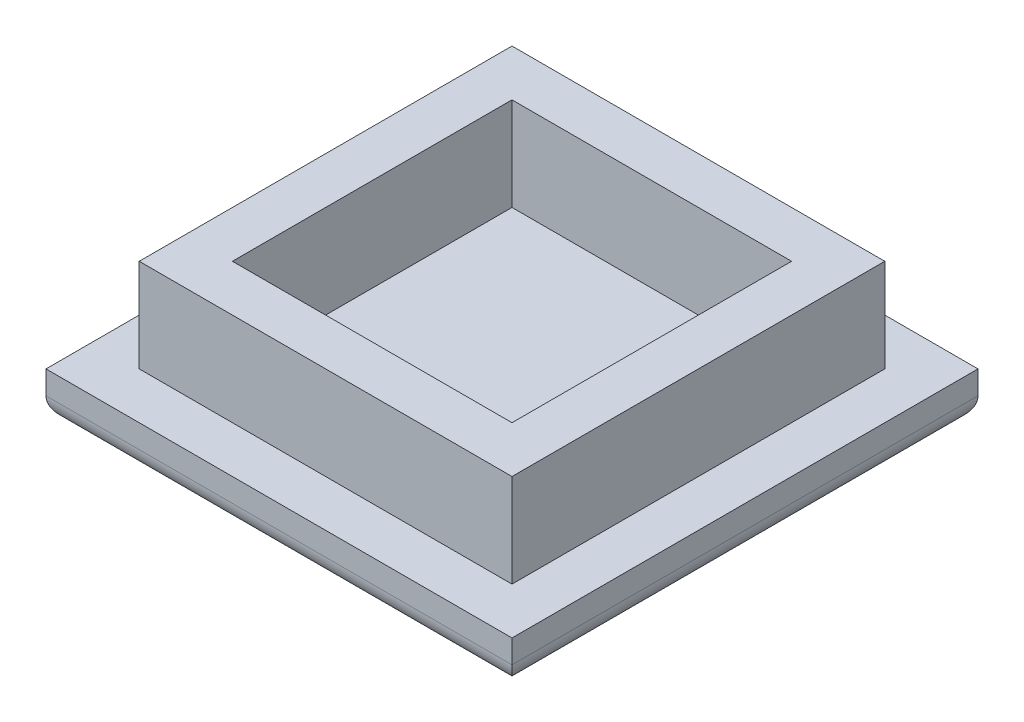
ISO-10303-21;
HEADER;
FILE_DESCRIPTION(('STEP AP214'),'2;1');
FILE_NAME('part.step','',(''),(''),'','','');
FILE_SCHEMA(('AUTOMOTIVE_DESIGN { 1 0 10303 214 1 1 1 1 }'));
ENDSEC;
DATA;
#1=APPLICATION_CONTEXT('core data for automotive mechanical design processes');
#2=APPLICATION_PROTOCOL_DEFINITION('international standard','automotive_design',2000,#1);
#3=PRODUCT_CONTEXT('',#1,'mechanical');
#4=PRODUCT('Part','Part','',(#3));
#5=PRODUCT_RELATED_PRODUCT_CATEGORY('part','',(#4));
#6=PRODUCT_DEFINITION_FORMATION('','',#4);
#7=PRODUCT_DEFINITION_CONTEXT('part definition',#1,'design');
#8=PRODUCT_DEFINITION('design','',#6,#7);
#9=PRODUCT_DEFINITION_SHAPE('','',#8);
#10=(LENGTH_UNIT() NAMED_UNIT(*) SI_UNIT(.MILLI.,.METRE.));
#11=(NAMED_UNIT(*) PLANE_ANGLE_UNIT() SI_UNIT($,.RADIAN.));
#12=(NAMED_UNIT(*) SI_UNIT($,.STERADIAN.) SOLID_ANGLE_UNIT());
#13=UNCERTAINTY_MEASURE_WITH_UNIT(LENGTH_MEASURE(1.E-05),#10,'distance_accuracy_value','');
#14=(GEOMETRIC_REPRESENTATION_CONTEXT(3) GLOBAL_UNCERTAINTY_ASSIGNED_CONTEXT((#13)) GLOBAL_UNIT_ASSIGNED_CONTEXT((#10,
#11,#12)) REPRESENTATION_CONTEXT('',''));
#15=CARTESIAN_POINT('',(0.,0.,0.));
#16=DIRECTION('',(0.,0.,1.));
#17=DIRECTION('',(1.,0.,0.));
#18=AXIS2_PLACEMENT_3D('',#15,#16,#17);
#19=CARTESIAN_POINT('',(0.,2.,0.));
#20=DIRECTION('',(0.,-1.,0.));
#21=DIRECTION('',(0.,0.,-1.));
#22=AXIS2_PLACEMENT_3D('',#19,#20,#21);
#23=PLANE('',#22);
#24=DIRECTION('',(0.,0.,-1.));
#25=VECTOR('',#24,1.);
#26=CARTESIAN_POINT('',(10.,2.,10.));
#27=LINE('',#26,#25);
#28=CARTESIAN_POINT('',(10.,2.,10.));
#29=VERTEX_POINT('',#28);
#30=CARTESIAN_POINT('',(10.,2.,-10.));
#31=VERTEX_POINT('',#30);
#32=EDGE_CURVE('E211',#29,#31,#27,.T.);
#33=ORIENTED_EDGE('',*,*,#32,.T.);
#34=DIRECTION('',(-1.,0.,0.));
#35=VECTOR('',#34,1.);
#36=CARTESIAN_POINT('',(-10.,2.,-10.));
#37=LINE('',#36,#35);
#38=CARTESIAN_POINT('',(-10.,2.,-10.));
#39=VERTEX_POINT('',#38);
#40=EDGE_CURVE('E214',#31,#39,#37,.T.);
#41=ORIENTED_EDGE('',*,*,#40,.T.);
#42=DIRECTION('',(0.,0.,1.));
#43=VECTOR('',#42,1.);
#44=CARTESIAN_POINT('',(-10.,2.,10.));
#45=LINE('',#44,#43);
#46=CARTESIAN_POINT('',(-10.,2.,10.));
#47=VERTEX_POINT('',#46);
#48=EDGE_CURVE('E216',#39,#47,#45,.T.);
#49=ORIENTED_EDGE('',*,*,#48,.T.);
#50=DIRECTION('',(1.,0.,0.));
#51=VECTOR('',#50,1.);
#52=CARTESIAN_POINT('',(-10.,2.,10.));
#53=LINE('',#52,#51);
#54=EDGE_CURVE('E218',#47,#29,#53,.T.);
#55=ORIENTED_EDGE('',*,*,#54,.T.);
#56=EDGE_LOOP('',(#33,#41,#49,#55));
#57=FACE_BOUND('',#56,.T.);
#58=DIRECTION('',(0.,0.,-1.));
#59=VECTOR('',#58,1.);
#60=CARTESIAN_POINT('',(8.,2.,8.));
#61=LINE('',#60,#59);
#62=CARTESIAN_POINT('',(8.,2.,8.));
#63=VERTEX_POINT('',#62);
#64=CARTESIAN_POINT('',(8.,2.,-8.));
#65=VERTEX_POINT('',#64);
#66=EDGE_CURVE('E155',#63,#65,#61,.T.);
#67=ORIENTED_EDGE('',*,*,#66,.F.);
#68=DIRECTION('',(1.,0.,0.));
#69=VECTOR('',#68,1.);
#70=CARTESIAN_POINT('',(-8.,2.,8.));
#71=LINE('',#70,#69);
#72=CARTESIAN_POINT('',(-8.,2.,8.));
#73=VERTEX_POINT('',#72);
#74=EDGE_CURVE('E183',#73,#63,#71,.T.);
#75=ORIENTED_EDGE('',*,*,#74,.F.);
#76=DIRECTION('',(0.,0.,1.));
#77=VECTOR('',#76,1.);
#78=CARTESIAN_POINT('',(-8.,2.,8.));
#79=LINE('',#78,#77);
#80=CARTESIAN_POINT('',(-8.,2.,-8.));
#81=VERTEX_POINT('',#80);
#82=EDGE_CURVE('E195',#81,#73,#79,.T.);
#83=ORIENTED_EDGE('',*,*,#82,.F.);
#84=DIRECTION('',(-1.,0.,0.));
#85=VECTOR('',#84,1.);
#86=CARTESIAN_POINT('',(-8.,2.,-8.));
#87=LINE('',#86,#85);
#88=EDGE_CURVE('E192',#65,#81,#87,.T.);
#89=ORIENTED_EDGE('',*,*,#88,.F.);
#90=EDGE_LOOP('',(#67,#75,#83,#89));
#91=FACE_BOUND('',#90,.T.);
#92=ADVANCED_FACE('F32',(#57,#91),#23,.F.);
#93=CARTESIAN_POINT('',(10.,2.,10.));
#94=DIRECTION('',(-1.,0.,0.));
#95=DIRECTION('',(0.,0.,1.));
#96=AXIS2_PLACEMENT_3D('',#93,#94,#95);
#97=PLANE('',#96);
#98=DIRECTION('',(0.,-1.,0.));
#99=VECTOR('',#98,1.);
#100=CARTESIAN_POINT('',(10.,2.,10.));
#101=LINE('',#100,#99);
#102=CARTESIAN_POINT('',(10.,1.,10.));
#103=VERTEX_POINT('',#102);
#104=EDGE_CURVE('E220',#29,#103,#101,.T.);
#105=ORIENTED_EDGE('',*,*,#104,.T.);
#106=DIRECTION('',(0.,0.,-1.));
#107=VECTOR('',#106,1.);
#108=CARTESIAN_POINT('',(10.,1.,-9.99999999999999));
#109=LINE('',#108,#107);
#110=CARTESIAN_POINT('',(10.,1.,-10.));
#111=VERTEX_POINT('',#110);
#112=EDGE_CURVE('E11',#103,#111,#109,.T.);
#113=ORIENTED_EDGE('',*,*,#112,.T.);
#114=DIRECTION('',(0.,-1.,0.));
#115=VECTOR('',#114,1.);
#116=CARTESIAN_POINT('',(10.,2.,-10.));
#117=LINE('',#116,#115);
#118=EDGE_CURVE('E226',#31,#111,#117,.T.);
#119=ORIENTED_EDGE('',*,*,#118,.F.);
#120=ORIENTED_EDGE('',*,*,#32,.F.);
#121=EDGE_LOOP('',(#105,#113,#119,#120));
#122=FACE_BOUND('',#121,.T.);
#123=ADVANCED_FACE('F279',(#122),#97,.F.);
#124=CARTESIAN_POINT('',(-10.,2.,-10.));
#125=DIRECTION('',(0.,0.,1.));
#126=DIRECTION('',(1.,0.,0.));
#127=AXIS2_PLACEMENT_3D('',#124,#125,#126);
#128=PLANE('',#127);
#129=ORIENTED_EDGE('',*,*,#118,.T.);
#130=DIRECTION('',(-1.,0.,0.));
#131=VECTOR('',#130,1.);
#132=CARTESIAN_POINT('',(-10.,1.,-10.));
#133=LINE('',#132,#131);
#134=CARTESIAN_POINT('',(-10.,1.,-10.));
#135=VERTEX_POINT('',#134);
#136=EDGE_CURVE('E229',#111,#135,#133,.T.);
#137=ORIENTED_EDGE('',*,*,#136,.T.);
#138=DIRECTION('',(0.,-1.,0.));
#139=VECTOR('',#138,1.);
#140=CARTESIAN_POINT('',(-10.,2.,-10.));
#141=LINE('',#140,#139);
#142=EDGE_CURVE('E224',#39,#135,#141,.T.);
#143=ORIENTED_EDGE('',*,*,#142,.F.);
#144=ORIENTED_EDGE('',*,*,#40,.F.);
#145=EDGE_LOOP('',(#129,#137,#143,#144));
#146=FACE_BOUND('',#145,.T.);
#147=ADVANCED_FACE('F270',(#146),#128,.F.);
#148=CARTESIAN_POINT('',(-10.,2.,10.));
#149=DIRECTION('',(1.,0.,0.));
#150=DIRECTION('',(0.,0.,-1.));
#151=AXIS2_PLACEMENT_3D('',#148,#149,#150);
#152=PLANE('',#151);
#153=ORIENTED_EDGE('',*,*,#142,.T.);
#154=DIRECTION('',(0.,0.,1.));
#155=VECTOR('',#154,1.);
#156=CARTESIAN_POINT('',(-10.,1.,10.));
#157=LINE('',#156,#155);
#158=CARTESIAN_POINT('',(-10.,1.,10.));
#159=VERTEX_POINT('',#158);
#160=EDGE_CURVE('E56',#135,#159,#157,.T.);
#161=ORIENTED_EDGE('',*,*,#160,.T.);
#162=DIRECTION('',(0.,-1.,0.));
#163=VECTOR('',#162,1.);
#164=CARTESIAN_POINT('',(-10.,2.,10.));
#165=LINE('',#164,#163);
#166=EDGE_CURVE('E222',#47,#159,#165,.T.);
#167=ORIENTED_EDGE('',*,*,#166,.F.);
#168=ORIENTED_EDGE('',*,*,#48,.F.);
#169=EDGE_LOOP('',(#153,#161,#167,#168));
#170=FACE_BOUND('',#169,.T.);
#171=ADVANCED_FACE('F273',(#170),#152,.F.);
#172=CARTESIAN_POINT('',(-10.,2.,10.));
#173=DIRECTION('',(0.,0.,-1.));
#174=DIRECTION('',(-1.,0.,0.));
#175=AXIS2_PLACEMENT_3D('',#172,#173,#174);
#176=PLANE('',#175);
#177=ORIENTED_EDGE('',*,*,#166,.T.);
#178=DIRECTION('',(1.,0.,0.));
#179=VECTOR('',#178,1.);
#180=CARTESIAN_POINT('',(10.,1.,10.));
#181=LINE('',#180,#179);
#182=EDGE_CURVE('E41',#159,#103,#181,.T.);
#183=ORIENTED_EDGE('',*,*,#182,.T.);
#184=ORIENTED_EDGE('',*,*,#104,.F.);
#185=ORIENTED_EDGE('',*,*,#54,.F.);
#186=EDGE_LOOP('',(#177,#183,#184,#185));
#187=FACE_BOUND('',#186,.T.);
#188=ADVANCED_FACE('F280',(#187),#176,.F.);
#189=CARTESIAN_POINT('',(0.,0.,0.));
#190=DIRECTION('',(0.,-1.,0.));
#191=DIRECTION('',(0.,0.,-1.));
#192=AXIS2_PLACEMENT_3D('',#189,#190,#191);
#193=PLANE('',#192);
#194=DIRECTION('',(0.,0.,1.));
#195=VECTOR('',#194,1.);
#196=CARTESIAN_POINT('',(-9.,0.,-9.99999999999999));
#197=LINE('',#196,#195);
#198=CARTESIAN_POINT('',(-9.,0.,9.));
#199=VERTEX_POINT('',#198);
#200=CARTESIAN_POINT('',(-9.,0.,-9.));
#201=VERTEX_POINT('',#200);
#202=EDGE_CURVE('E236',#199,#201,#197,.F.);
#203=ORIENTED_EDGE('',*,*,#202,.T.);
#204=DIRECTION('',(-1.,0.,0.));
#205=VECTOR('',#204,1.);
#206=CARTESIAN_POINT('',(10.,0.,-9.));
#207=LINE('',#206,#205);
#208=CARTESIAN_POINT('',(9.,0.,-9.));
#209=VERTEX_POINT('',#208);
#210=EDGE_CURVE('E238',#201,#209,#207,.F.);
#211=ORIENTED_EDGE('',*,*,#210,.T.);
#212=DIRECTION('',(0.,0.,-1.));
#213=VECTOR('',#212,1.);
#214=CARTESIAN_POINT('',(9.,0.,10.));
#215=LINE('',#214,#213);
#216=CARTESIAN_POINT('',(9.,0.,9.));
#217=VERTEX_POINT('',#216);
#218=EDGE_CURVE('E232',#209,#217,#215,.F.);
#219=ORIENTED_EDGE('',*,*,#218,.T.);
#220=DIRECTION('',(1.,0.,0.));
#221=VECTOR('',#220,1.);
#222=CARTESIAN_POINT('',(-10.,0.,9.));
#223=LINE('',#222,#221);
#224=EDGE_CURVE('E234',#217,#199,#223,.F.);
#225=ORIENTED_EDGE('',*,*,#224,.T.);
#226=EDGE_LOOP('',(#203,#211,#219,#225));
#227=FACE_BOUND('',#226,.T.);
#228=ADVANCED_FACE('F261',(#227),#193,.T.);
#229=CARTESIAN_POINT('',(0.,6.,0.));
#230=DIRECTION('',(0.,-1.,0.));
#231=DIRECTION('',(0.,0.,-1.));
#232=AXIS2_PLACEMENT_3D('',#229,#230,#231);
#233=PLANE('',#232);
#234=DIRECTION('',(0.,0.,-1.));
#235=VECTOR('',#234,1.);
#236=CARTESIAN_POINT('',(8.,6.,8.));
#237=LINE('',#236,#235);
#238=CARTESIAN_POINT('',(8.,6.,8.));
#239=VERTEX_POINT('',#238);
#240=CARTESIAN_POINT('',(8.,6.,-8.));
#241=VERTEX_POINT('',#240);
#242=EDGE_CURVE('E179',#239,#241,#237,.T.);
#243=ORIENTED_EDGE('',*,*,#242,.T.);
#244=DIRECTION('',(-1.,0.,0.));
#245=VECTOR('',#244,1.);
#246=CARTESIAN_POINT('',(-8.,6.,-8.));
#247=LINE('',#246,#245);
#248=CARTESIAN_POINT('',(-8.,6.,-8.));
#249=VERTEX_POINT('',#248);
#250=EDGE_CURVE('E182',#241,#249,#247,.T.);
#251=ORIENTED_EDGE('',*,*,#250,.T.);
#252=DIRECTION('',(0.,0.,1.));
#253=VECTOR('',#252,1.);
#254=CARTESIAN_POINT('',(-8.,6.,8.));
#255=LINE('',#254,#253);
#256=CARTESIAN_POINT('',(-8.,6.,8.));
#257=VERTEX_POINT('',#256);
#258=EDGE_CURVE('E185',#249,#257,#255,.T.);
#259=ORIENTED_EDGE('',*,*,#258,.T.);
#260=DIRECTION('',(1.,0.,0.));
#261=VECTOR('',#260,1.);
#262=CARTESIAN_POINT('',(-8.,6.,8.));
#263=LINE('',#262,#261);
#264=EDGE_CURVE('E187',#257,#239,#263,.T.);
#265=ORIENTED_EDGE('',*,*,#264,.T.);
#266=EDGE_LOOP('',(#243,#251,#259,#265));
#267=FACE_BOUND('',#266,.T.);
#268=DIRECTION('',(0.,0.,1.));
#269=VECTOR('',#268,1.);
#270=CARTESIAN_POINT('',(-6.,6.,6.));
#271=LINE('',#270,#269);
#272=CARTESIAN_POINT('',(-6.,6.,-6.));
#273=VERTEX_POINT('',#272);
#274=CARTESIAN_POINT('',(-6.,6.,6.));
#275=VERTEX_POINT('',#274);
#276=EDGE_CURVE('E137',#273,#275,#271,.T.);
#277=ORIENTED_EDGE('',*,*,#276,.F.);
#278=DIRECTION('',(-1.,0.,0.));
#279=VECTOR('',#278,1.);
#280=CARTESIAN_POINT('',(-6.,6.,-6.));
#281=LINE('',#280,#279);
#282=CARTESIAN_POINT('',(6.,6.,-6.));
#283=VERTEX_POINT('',#282);
#284=EDGE_CURVE('E163',#283,#273,#281,.T.);
#285=ORIENTED_EDGE('',*,*,#284,.F.);
#286=DIRECTION('',(0.,0.,-1.));
#287=VECTOR('',#286,1.);
#288=CARTESIAN_POINT('',(6.,6.,6.));
#289=LINE('',#288,#287);
#290=CARTESIAN_POINT('',(6.,6.,6.));
#291=VERTEX_POINT('',#290);
#292=EDGE_CURVE('E161',#291,#283,#289,.T.);
#293=ORIENTED_EDGE('',*,*,#292,.F.);
#294=DIRECTION('',(1.,0.,0.));
#295=VECTOR('',#294,1.);
#296=CARTESIAN_POINT('',(-6.,6.,6.));
#297=LINE('',#296,#295);
#298=EDGE_CURVE('E147',#275,#291,#297,.T.);
#299=ORIENTED_EDGE('',*,*,#298,.F.);
#300=EDGE_LOOP('',(#277,#285,#293,#299));
#301=FACE_BOUND('',#300,.T.);
#302=ADVANCED_FACE('F159',(#267,#301),#233,.F.);
#303=CARTESIAN_POINT('',(8.,6.,8.));
#304=DIRECTION('',(-1.,0.,0.));
#305=DIRECTION('',(0.,0.,1.));
#306=AXIS2_PLACEMENT_3D('',#303,#304,#305);
#307=PLANE('',#306);
#308=ORIENTED_EDGE('',*,*,#66,.T.);
#309=DIRECTION('',(0.,-1.,0.));
#310=VECTOR('',#309,1.);
#311=CARTESIAN_POINT('',(8.,6.,-8.));
#312=LINE('',#311,#310);
#313=EDGE_CURVE('E208',#241,#65,#312,.T.);
#314=ORIENTED_EDGE('',*,*,#313,.F.);
#315=ORIENTED_EDGE('',*,*,#242,.F.);
#316=DIRECTION('',(0.,-1.,0.));
#317=VECTOR('',#316,1.);
#318=CARTESIAN_POINT('',(8.,6.,8.));
#319=LINE('',#318,#317);
#320=EDGE_CURVE('E189',#239,#63,#319,.T.);
#321=ORIENTED_EDGE('',*,*,#320,.T.);
#322=EDGE_LOOP('',(#308,#314,#315,#321));
#323=FACE_BOUND('',#322,.T.);
#324=ADVANCED_FACE('F322',(#323),#307,.F.);
#325=CARTESIAN_POINT('',(-8.,6.,-8.));
#326=DIRECTION('',(0.,0.,1.));
#327=DIRECTION('',(1.,0.,0.));
#328=AXIS2_PLACEMENT_3D('',#325,#326,#327);
#329=PLANE('',#328);
#330=ORIENTED_EDGE('',*,*,#88,.T.);
#331=DIRECTION('',(0.,-1.,0.));
#332=VECTOR('',#331,1.);
#333=CARTESIAN_POINT('',(-8.,6.,-8.));
#334=LINE('',#333,#332);
#335=EDGE_CURVE('E205',#249,#81,#334,.T.);
#336=ORIENTED_EDGE('',*,*,#335,.F.);
#337=ORIENTED_EDGE('',*,*,#250,.F.);
#338=ORIENTED_EDGE('',*,*,#313,.T.);
#339=EDGE_LOOP('',(#330,#336,#337,#338));
#340=FACE_BOUND('',#339,.T.);
#341=ADVANCED_FACE('F330',(#340),#329,.F.);
#342=CARTESIAN_POINT('',(-8.,6.,8.));
#343=DIRECTION('',(1.,0.,0.));
#344=DIRECTION('',(0.,0.,-1.));
#345=AXIS2_PLACEMENT_3D('',#342,#343,#344);
#346=PLANE('',#345);
#347=ORIENTED_EDGE('',*,*,#82,.T.);
#348=DIRECTION('',(0.,-1.,0.));
#349=VECTOR('',#348,1.);
#350=CARTESIAN_POINT('',(-8.,6.,8.));
#351=LINE('',#350,#349);
#352=EDGE_CURVE('E202',#257,#73,#351,.T.);
#353=ORIENTED_EDGE('',*,*,#352,.F.);
#354=ORIENTED_EDGE('',*,*,#258,.F.);
#355=ORIENTED_EDGE('',*,*,#335,.T.);
#356=EDGE_LOOP('',(#347,#353,#354,#355));
#357=FACE_BOUND('',#356,.T.);
#358=ADVANCED_FACE('F326',(#357),#346,.F.);
#359=CARTESIAN_POINT('',(-8.,6.,8.));
#360=DIRECTION('',(0.,0.,-1.));
#361=DIRECTION('',(-1.,0.,0.));
#362=AXIS2_PLACEMENT_3D('',#359,#360,#361);
#363=PLANE('',#362);
#364=ORIENTED_EDGE('',*,*,#74,.T.);
#365=ORIENTED_EDGE('',*,*,#320,.F.);
#366=ORIENTED_EDGE('',*,*,#264,.F.);
#367=ORIENTED_EDGE('',*,*,#352,.T.);
#368=EDGE_LOOP('',(#364,#365,#366,#367));
#369=FACE_BOUND('',#368,.T.);
#370=ADVANCED_FACE('F319',(#369),#363,.F.);
#371=CARTESIAN_POINT('',(-6.,6.,6.));
#372=DIRECTION('',(1.,0.,0.));
#373=DIRECTION('',(0.,0.,-1.));
#374=AXIS2_PLACEMENT_3D('',#371,#372,#373);
#375=PLANE('',#374);
#376=DIRECTION('',(0.,0.,1.));
#377=VECTOR('',#376,1.);
#378=CARTESIAN_POINT('',(-6.,2.,6.));
#379=LINE('',#378,#377);
#380=CARTESIAN_POINT('',(-6.,2.,-6.));
#381=VERTEX_POINT('',#380);
#382=CARTESIAN_POINT('',(-6.,2.,6.));
#383=VERTEX_POINT('',#382);
#384=EDGE_CURVE('E167',#381,#383,#379,.T.);
#385=ORIENTED_EDGE('',*,*,#384,.F.);
#386=DIRECTION('',(0.,-1.,0.));
#387=VECTOR('',#386,1.);
#388=CARTESIAN_POINT('',(-6.,6.,-6.));
#389=LINE('',#388,#387);
#390=EDGE_CURVE('E143',#273,#381,#389,.T.);
#391=ORIENTED_EDGE('',*,*,#390,.F.);
#392=ORIENTED_EDGE('',*,*,#276,.T.);
#393=DIRECTION('',(0.,-1.,0.));
#394=VECTOR('',#393,1.);
#395=CARTESIAN_POINT('',(-6.,6.,6.));
#396=LINE('',#395,#394);
#397=EDGE_CURVE('E141',#275,#383,#396,.T.);
#398=ORIENTED_EDGE('',*,*,#397,.T.);
#399=EDGE_LOOP('',(#385,#391,#392,#398));
#400=FACE_BOUND('',#399,.T.);
#401=ADVANCED_FACE('F140',(#400),#375,.T.);
#402=CARTESIAN_POINT('',(-6.,6.,6.));
#403=DIRECTION('',(0.,0.,-1.));
#404=DIRECTION('',(-1.,0.,0.));
#405=AXIS2_PLACEMENT_3D('',#402,#403,#404);
#406=PLANE('',#405);
#407=DIRECTION('',(1.,0.,0.));
#408=VECTOR('',#407,1.);
#409=CARTESIAN_POINT('',(-6.,2.,6.));
#410=LINE('',#409,#408);
#411=CARTESIAN_POINT('',(6.,2.,6.));
#412=VERTEX_POINT('',#411);
#413=EDGE_CURVE('E154',#383,#412,#410,.T.);
#414=ORIENTED_EDGE('',*,*,#413,.F.);
#415=ORIENTED_EDGE('',*,*,#397,.F.);
#416=ORIENTED_EDGE('',*,*,#298,.T.);
#417=DIRECTION('',(0.,-1.,0.));
#418=VECTOR('',#417,1.);
#419=CARTESIAN_POINT('',(6.,6.,6.));
#420=LINE('',#419,#418);
#421=EDGE_CURVE('E156',#291,#412,#420,.T.);
#422=ORIENTED_EDGE('',*,*,#421,.T.);
#423=EDGE_LOOP('',(#414,#415,#416,#422));
#424=FACE_BOUND('',#423,.T.);
#425=ADVANCED_FACE('F151',(#424),#406,.T.);
#426=CARTESIAN_POINT('',(6.,6.,6.));
#427=DIRECTION('',(-1.,0.,0.));
#428=DIRECTION('',(0.,0.,1.));
#429=AXIS2_PLACEMENT_3D('',#426,#427,#428);
#430=PLANE('',#429);
#431=DIRECTION('',(0.,0.,-1.));
#432=VECTOR('',#431,1.);
#433=CARTESIAN_POINT('',(6.,2.,6.));
#434=LINE('',#433,#432);
#435=CARTESIAN_POINT('',(6.,2.,-6.));
#436=VERTEX_POINT('',#435);
#437=EDGE_CURVE('E170',#412,#436,#434,.T.);
#438=ORIENTED_EDGE('',*,*,#437,.F.);
#439=ORIENTED_EDGE('',*,*,#421,.F.);
#440=ORIENTED_EDGE('',*,*,#292,.T.);
#441=DIRECTION('',(0.,-1.,0.));
#442=VECTOR('',#441,1.);
#443=CARTESIAN_POINT('',(6.,6.,-6.));
#444=LINE('',#443,#442);
#445=EDGE_CURVE('E176',#283,#436,#444,.T.);
#446=ORIENTED_EDGE('',*,*,#445,.T.);
#447=EDGE_LOOP('',(#438,#439,#440,#446));
#448=FACE_BOUND('',#447,.T.);
#449=ADVANCED_FACE('F304',(#448),#430,.T.);
#450=CARTESIAN_POINT('',(-6.,6.,-6.));
#451=DIRECTION('',(0.,0.,1.));
#452=DIRECTION('',(1.,0.,0.));
#453=AXIS2_PLACEMENT_3D('',#450,#451,#452);
#454=PLANE('',#453);
#455=DIRECTION('',(-1.,0.,0.));
#456=VECTOR('',#455,1.);
#457=CARTESIAN_POINT('',(-6.,2.,-6.));
#458=LINE('',#457,#456);
#459=EDGE_CURVE('E148',#436,#381,#458,.T.);
#460=ORIENTED_EDGE('',*,*,#459,.F.);
#461=ORIENTED_EDGE('',*,*,#445,.F.);
#462=ORIENTED_EDGE('',*,*,#284,.T.);
#463=ORIENTED_EDGE('',*,*,#390,.T.);
#464=EDGE_LOOP('',(#460,#461,#462,#463));
#465=FACE_BOUND('',#464,.T.);
#466=ADVANCED_FACE('F298',(#465),#454,.T.);
#467=ORIENTED_EDGE('',*,*,#459,.T.);
#468=ORIENTED_EDGE('',*,*,#384,.T.);
#469=ORIENTED_EDGE('',*,*,#413,.T.);
#470=ORIENTED_EDGE('',*,*,#437,.T.);
#471=EDGE_LOOP('',(#467,#468,#469,#470));
#472=FACE_BOUND('',#471,.T.);
#473=ADVANCED_FACE('F291',(#472),#23,.F.);
#474=CARTESIAN_POINT('',(-10.,1.,9.));
#475=DIRECTION('',(-1.,0.,0.));
#476=DIRECTION('',(0.,0.,1.));
#477=AXIS2_PLACEMENT_3D('',#474,#475,#476);
#478=CYLINDRICAL_SURFACE('',#477,1.);
#479=CARTESIAN_POINT('',(-9.,1.,9.));
#480=DIRECTION('',(-0.707106781186547,0.,-0.707106781186547));
#481=DIRECTION('',(-0.707106781186547,0.,0.707106781186547));
#482=AXIS2_PLACEMENT_3D('',#479,#480,#481);
#483=ELLIPSE('',#482,1.41421356237309,1.);
#484=EDGE_CURVE('E246',#199,#159,#483,.T.);
#485=ORIENTED_EDGE('',*,*,#484,.F.);
#486=ORIENTED_EDGE('',*,*,#224,.F.);
#487=CARTESIAN_POINT('',(9.,1.,9.));
#488=DIRECTION('',(-0.707106781186547,0.,0.707106781186547));
#489=DIRECTION('',(0.707106781186547,0.,0.707106781186547));
#490=AXIS2_PLACEMENT_3D('',#487,#488,#489);
#491=ELLIPSE('',#490,1.41421356237309,1.);
#492=EDGE_CURVE('E36',#103,#217,#491,.F.);
#493=ORIENTED_EDGE('',*,*,#492,.F.);
#494=ORIENTED_EDGE('',*,*,#182,.F.);
#495=EDGE_LOOP('',(#485,#486,#493,#494));
#496=FACE_BOUND('',#495,.T.);
#497=ADVANCED_FACE('F34',(#496),#478,.T.);
#498=CARTESIAN_POINT('',(9.,1.,10.));
#499=DIRECTION('',(0.,0.,1.));
#500=DIRECTION('',(1.,0.,0.));
#501=AXIS2_PLACEMENT_3D('',#498,#499,#500);
#502=CYLINDRICAL_SURFACE('',#501,1.);
#503=ORIENTED_EDGE('',*,*,#492,.T.);
#504=ORIENTED_EDGE('',*,*,#218,.F.);
#505=CARTESIAN_POINT('',(9.,1.,-9.));
#506=DIRECTION('',(0.707106781186547,0.,0.707106781186547));
#507=DIRECTION('',(-0.707106781186547,0.,0.707106781186547));
#508=AXIS2_PLACEMENT_3D('',#505,#506,#507);
#509=ELLIPSE('',#508,1.41421356237309,1.);
#510=EDGE_CURVE('E245',#111,#209,#509,.F.);
#511=ORIENTED_EDGE('',*,*,#510,.F.);
#512=ORIENTED_EDGE('',*,*,#112,.F.);
#513=EDGE_LOOP('',(#503,#504,#511,#512));
#514=FACE_BOUND('',#513,.T.);
#515=ADVANCED_FACE('F256',(#514),#502,.T.);
#516=CARTESIAN_POINT('',(-9.,1.,10.));
#517=DIRECTION('',(0.,0.,-1.));
#518=DIRECTION('',(-1.,0.,0.));
#519=AXIS2_PLACEMENT_3D('',#516,#517,#518);
#520=CYLINDRICAL_SURFACE('',#519,1.);
#521=ORIENTED_EDGE('',*,*,#484,.T.);
#522=ORIENTED_EDGE('',*,*,#160,.F.);
#523=CARTESIAN_POINT('',(-9.,1.,-9.));
#524=DIRECTION('',(0.707106781186547,0.,-0.707106781186547));
#525=DIRECTION('',(-0.707106781186547,0.,-0.707106781186547));
#526=AXIS2_PLACEMENT_3D('',#523,#524,#525);
#527=ELLIPSE('',#526,1.41421356237309,1.);
#528=EDGE_CURVE('E243',#201,#135,#527,.T.);
#529=ORIENTED_EDGE('',*,*,#528,.F.);
#530=ORIENTED_EDGE('',*,*,#202,.F.);
#531=EDGE_LOOP('',(#521,#522,#529,#530));
#532=FACE_BOUND('',#531,.T.);
#533=ADVANCED_FACE('F267',(#532),#520,.T.);
#534=CARTESIAN_POINT('',(-10.,1.,-9.));
#535=DIRECTION('',(1.,0.,0.));
#536=DIRECTION('',(0.,0.,-1.));
#537=AXIS2_PLACEMENT_3D('',#534,#535,#536);
#538=CYLINDRICAL_SURFACE('',#537,1.);
#539=ORIENTED_EDGE('',*,*,#510,.T.);
#540=ORIENTED_EDGE('',*,*,#210,.F.);
#541=ORIENTED_EDGE('',*,*,#528,.T.);
#542=ORIENTED_EDGE('',*,*,#136,.F.);
#543=EDGE_LOOP('',(#539,#540,#541,#542));
#544=FACE_BOUND('',#543,.T.);
#545=ADVANCED_FACE('F265',(#544),#538,.T.);
#546=CLOSED_SHELL('',(#92,#123,#147,#171,#188,#228,#302,#324,#341,#358,#370,#401,#425,#449,#466,
#473,#497,#515,#533,#545));
#547=MANIFOLD_SOLID_BREP('B2',#546);
#548=ADVANCED_BREP_SHAPE_REPRESENTATION('',(#18,#547),#14);
#549=SHAPE_DEFINITION_REPRESENTATION(#9,#548);
ENDSEC;
END-ISO-10303-21;
